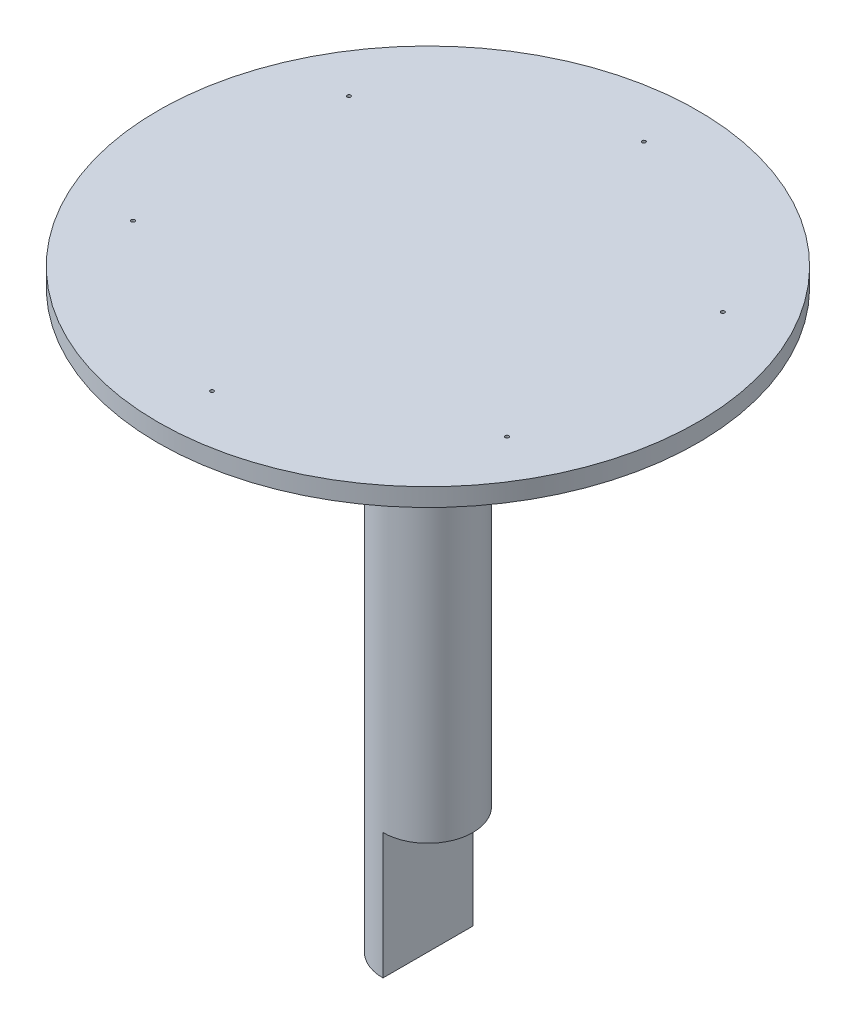
ISO-10303-21;
HEADER;
FILE_DESCRIPTION(('STEP AP214'),'2;1');
FILE_NAME('part.step','',(''),(''),'','','');
FILE_SCHEMA(('AUTOMOTIVE_DESIGN { 1 0 10303 214 1 1 1 1 }'));
ENDSEC;
DATA;
#1=APPLICATION_CONTEXT('core data for automotive mechanical design processes');
#2=APPLICATION_PROTOCOL_DEFINITION('international standard','automotive_design',2000,#1);
#3=PRODUCT_CONTEXT('',#1,'mechanical');
#4=PRODUCT('Part','Part','',(#3));
#5=PRODUCT_RELATED_PRODUCT_CATEGORY('part','',(#4));
#6=PRODUCT_DEFINITION_FORMATION('','',#4);
#7=PRODUCT_DEFINITION_CONTEXT('part definition',#1,'design');
#8=PRODUCT_DEFINITION('design','',#6,#7);
#9=PRODUCT_DEFINITION_SHAPE('','',#8);
#10=(LENGTH_UNIT() NAMED_UNIT(*) SI_UNIT(.MILLI.,.METRE.));
#11=(NAMED_UNIT(*) PLANE_ANGLE_UNIT() SI_UNIT($,.RADIAN.));
#12=(NAMED_UNIT(*) SI_UNIT($,.STERADIAN.) SOLID_ANGLE_UNIT());
#13=UNCERTAINTY_MEASURE_WITH_UNIT(LENGTH_MEASURE(1.E-05),#10,'distance_accuracy_value','');
#14=(GEOMETRIC_REPRESENTATION_CONTEXT(3) GLOBAL_UNCERTAINTY_ASSIGNED_CONTEXT((#13)) GLOBAL_UNIT_ASSIGNED_CONTEXT((#10,
#11,#12)) REPRESENTATION_CONTEXT('',''));
#15=CARTESIAN_POINT('',(0.,0.,0.));
#16=DIRECTION('',(0.,0.,1.));
#17=DIRECTION('',(1.,0.,0.));
#18=AXIS2_PLACEMENT_3D('',#15,#16,#17);
#19=CARTESIAN_POINT('',(31.049273333984,320.,8.00239003453196));
#20=DIRECTION('',(0.,-1.,0.));
#21=DIRECTION('',(0.,0.,-1.));
#22=AXIS2_PLACEMENT_3D('',#19,#20,#21);
#23=CYLINDRICAL_SURFACE('',#22,25.);
#24=CARTESIAN_POINT('',(31.049273333984,320.,8.00239003453196));
#25=DIRECTION('',(0.,1.,0.));
#26=DIRECTION('',(0.,0.,1.));
#27=AXIS2_PLACEMENT_3D('',#24,#25,#26);
#28=CIRCLE('',#27,25.);
#29=CARTESIAN_POINT('',(31.049273333984,320.,33.002390034532));
#30=VERTEX_POINT('',#29);
#31=EDGE_CURVE('E11',#30,#30,#28,.T.);
#32=ORIENTED_EDGE('',*,*,#31,.F.);
#33=EDGE_LOOP('',(#32));
#34=FACE_BOUND('',#33,.T.);
#35=CARTESIAN_POINT('',(31.049273333984,70.,8.00239003453196));
#36=DIRECTION('',(0.,-1.,0.));
#37=DIRECTION('',(0.,0.,-1.));
#38=AXIS2_PLACEMENT_3D('',#35,#36,#37);
#39=CIRCLE('',#38,25.);
#40=CARTESIAN_POINT('',(31.049273333984,70.,-16.9976099654681));
#41=VERTEX_POINT('',#40);
#42=CARTESIAN_POINT('',(31.049273333984,70.,33.002390034532));
#43=VERTEX_POINT('',#42);
#44=EDGE_CURVE('E64',#41,#43,#39,.T.);
#45=ORIENTED_EDGE('',*,*,#44,.F.);
#46=DIRECTION('',(0.,-1.,0.));
#47=VECTOR('',#46,1.);
#48=CARTESIAN_POINT('',(31.049273333984,70.,-16.9976099654681));
#49=LINE('',#48,#47);
#50=CARTESIAN_POINT('',(31.049273333984,0.,-16.9976099654681));
#51=VERTEX_POINT('',#50);
#52=EDGE_CURVE('E54',#41,#51,#49,.T.);
#53=ORIENTED_EDGE('',*,*,#52,.T.);
#54=CARTESIAN_POINT('',(31.049273333984,0.,8.00239003453196));
#55=DIRECTION('',(0.,1.,0.));
#56=DIRECTION('',(0.,0.,1.));
#57=AXIS2_PLACEMENT_3D('',#54,#55,#56);
#58=CIRCLE('',#57,25.);
#59=CARTESIAN_POINT('',(31.049273333984,0.,33.002390034532));
#60=VERTEX_POINT('',#59);
#61=EDGE_CURVE('E37',#51,#60,#58,.T.);
#62=ORIENTED_EDGE('',*,*,#61,.T.);
#63=DIRECTION('',(0.,-1.,0.));
#64=VECTOR('',#63,1.);
#65=CARTESIAN_POINT('',(31.049273333984,70.,33.002390034532));
#66=LINE('',#65,#64);
#67=EDGE_CURVE('E48',#43,#60,#66,.T.);
#68=ORIENTED_EDGE('',*,*,#67,.F.);
#69=EDGE_LOOP('',(#45,#53,#62,#68));
#70=FACE_BOUND('',#69,.T.);
#71=ADVANCED_FACE('F34',(#34,#70),#23,.T.);
#72=CARTESIAN_POINT('',(0.,0.,0.));
#73=DIRECTION('',(0.,1.,0.));
#74=DIRECTION('',(0.,0.,1.));
#75=AXIS2_PLACEMENT_3D('',#72,#73,#74);
#76=PLANE('',#75);
#77=ORIENTED_EDGE('',*,*,#61,.F.);
#78=DIRECTION('',(0.,0.,-1.));
#79=VECTOR('',#78,1.);
#80=CARTESIAN_POINT('',(31.049273333984,0.,0.));
#81=LINE('',#80,#79);
#82=EDGE_CURVE('E59',#60,#51,#81,.T.);
#83=ORIENTED_EDGE('',*,*,#82,.F.);
#84=EDGE_LOOP('',(#77,#83));
#85=FACE_BOUND('',#84,.T.);
#86=ADVANCED_FACE('F70',(#85),#76,.F.);
#87=CARTESIAN_POINT('',(31.049273333984,70.,0.));
#88=DIRECTION('',(-1.,0.,0.));
#89=DIRECTION('',(0.,0.,1.));
#90=AXIS2_PLACEMENT_3D('',#87,#88,#89);
#91=PLANE('',#90);
#92=ORIENTED_EDGE('',*,*,#82,.T.);
#93=ORIENTED_EDGE('',*,*,#52,.F.);
#94=DIRECTION('',(0.,0.,-1.));
#95=VECTOR('',#94,1.);
#96=CARTESIAN_POINT('',(31.049273333984,70.,0.));
#97=LINE('',#96,#95);
#98=EDGE_CURVE('E166',#43,#41,#97,.T.);
#99=ORIENTED_EDGE('',*,*,#98,.F.);
#100=ORIENTED_EDGE('',*,*,#67,.T.);
#101=EDGE_LOOP('',(#92,#93,#99,#100));
#102=FACE_BOUND('',#101,.T.);
#103=ADVANCED_FACE('F60',(#102),#91,.F.);
#104=CARTESIAN_POINT('',(0.,70.,0.));
#105=DIRECTION('',(0.,-1.,0.));
#106=DIRECTION('',(0.,0.,-1.));
#107=AXIS2_PLACEMENT_3D('',#104,#105,#106);
#108=PLANE('',#107);
#109=ORIENTED_EDGE('',*,*,#44,.T.);
#110=ORIENTED_EDGE('',*,*,#98,.T.);
#111=EDGE_LOOP('',(#109,#110));
#112=FACE_BOUND('',#111,.T.);
#113=ADVANCED_FACE('F76',(#112),#108,.T.);
#114=CARTESIAN_POINT('',(31.049273333984,320.,8.00239003453196));
#115=DIRECTION('',(0.,1.,0.));
#116=DIRECTION('',(0.,0.,1.));
#117=AXIS2_PLACEMENT_3D('',#114,#115,#116);
#118=PLANE('',#117);
#119=CARTESIAN_POINT('',(134.972321788117,320.,68.0023900345306));
#120=DIRECTION('',(0.,1.,0.));
#121=DIRECTION('',(0.,0.,1.));
#122=AXIS2_PLACEMENT_3D('',#119,#120,#121);
#123=CIRCLE('',#122,0.999999999999998);
#124=CARTESIAN_POINT('',(134.972321788117,320.,69.0023900345306));
#125=VERTEX_POINT('',#124);
#126=EDGE_CURVE('E123',#125,#125,#123,.T.);
#127=ORIENTED_EDGE('',*,*,#126,.T.);
#128=EDGE_LOOP('',(#127));
#129=FACE_BOUND('',#128,.T.);
#130=CARTESIAN_POINT('',(134.972321788117,320.,-51.9976099654682));
#131=DIRECTION('',(0.,1.,0.));
#132=DIRECTION('',(0.,0.,1.));
#133=AXIS2_PLACEMENT_3D('',#130,#131,#132);
#134=CIRCLE('',#133,0.999999999999968);
#135=CARTESIAN_POINT('',(134.972321788117,320.,-50.9976099654682));
#136=VERTEX_POINT('',#135);
#137=EDGE_CURVE('E131',#136,#136,#134,.T.);
#138=ORIENTED_EDGE('',*,*,#137,.T.);
#139=EDGE_LOOP('',(#138));
#140=FACE_BOUND('',#139,.T.);
#141=CARTESIAN_POINT('',(31.0492733339836,320.,-111.997609965468));
#142=DIRECTION('',(0.,1.,0.));
#143=DIRECTION('',(0.,0.,1.));
#144=AXIS2_PLACEMENT_3D('',#141,#142,#143);
#145=CIRCLE('',#144,1.00000000000001);
#146=CARTESIAN_POINT('',(31.0492733339836,320.,-110.997609965468));
#147=VERTEX_POINT('',#146);
#148=EDGE_CURVE('E137',#147,#147,#145,.T.);
#149=ORIENTED_EDGE('',*,*,#148,.T.);
#150=EDGE_LOOP('',(#149));
#151=FACE_BOUND('',#150,.T.);
#152=CARTESIAN_POINT('',(-72.873775120149,320.,-51.9976099654674));
#153=DIRECTION('',(0.,1.,0.));
#154=DIRECTION('',(0.,0.,1.));
#155=AXIS2_PLACEMENT_3D('',#152,#153,#154);
#156=CIRCLE('',#155,0.999999999999998);
#157=CARTESIAN_POINT('',(-72.873775120149,320.,-50.9976099654674));
#158=VERTEX_POINT('',#157);
#159=EDGE_CURVE('E143',#158,#158,#156,.T.);
#160=ORIENTED_EDGE('',*,*,#159,.T.);
#161=EDGE_LOOP('',(#160));
#162=FACE_BOUND('',#161,.T.);
#163=CARTESIAN_POINT('',(-72.8737751201481,320.,68.0023900345328));
#164=DIRECTION('',(0.,1.,0.));
#165=DIRECTION('',(0.,0.,1.));
#166=AXIS2_PLACEMENT_3D('',#163,#164,#165);
#167=CIRCLE('',#166,0.999999999999981);
#168=CARTESIAN_POINT('',(-72.8737751201481,320.,69.0023900345328));
#169=VERTEX_POINT('',#168);
#170=EDGE_CURVE('E149',#169,#169,#167,.T.);
#171=ORIENTED_EDGE('',*,*,#170,.T.);
#172=EDGE_LOOP('',(#171));
#173=FACE_BOUND('',#172,.T.);
#174=CARTESIAN_POINT('',(31.0492733339852,320.,128.002390034532));
#175=DIRECTION('',(0.,1.,0.));
#176=DIRECTION('',(0.,0.,1.));
#177=AXIS2_PLACEMENT_3D('',#174,#175,#176);
#178=CIRCLE('',#177,0.999999999999998);
#179=CARTESIAN_POINT('',(31.0492733339852,320.,129.002390034532));
#180=VERTEX_POINT('',#179);
#181=EDGE_CURVE('E155',#180,#180,#178,.T.);
#182=ORIENTED_EDGE('',*,*,#181,.T.);
#183=EDGE_LOOP('',(#182));
#184=FACE_BOUND('',#183,.T.);
#185=CARTESIAN_POINT('',(31.049273333984,320.,8.00239003453196));
#186=DIRECTION('',(0.,1.,0.));
#187=DIRECTION('',(0.,0.,1.));
#188=AXIS2_PLACEMENT_3D('',#185,#186,#187);
#189=CIRCLE('',#188,150.);
#190=CARTESIAN_POINT('',(31.049273333984,320.,158.002390034532));
#191=VERTEX_POINT('',#190);
#192=EDGE_CURVE('E158',#191,#191,#189,.T.);
#193=ORIENTED_EDGE('',*,*,#192,.F.);
#194=EDGE_LOOP('',(#193));
#195=FACE_BOUND('',#194,.T.);
#196=ORIENTED_EDGE('',*,*,#31,.T.);
#197=EDGE_LOOP('',(#196));
#198=FACE_BOUND('',#197,.T.);
#199=ADVANCED_FACE('F82',(#129,#140,#151,#162,#173,#184,#195,#198),#118,.F.);
#200=CARTESIAN_POINT('',(31.049273333984,330.,8.00239003453196));
#201=DIRECTION('',(0.,-1.,0.));
#202=DIRECTION('',(0.,0.,-1.));
#203=AXIS2_PLACEMENT_3D('',#200,#201,#202);
#204=CYLINDRICAL_SURFACE('',#203,150.);
#205=CARTESIAN_POINT('',(31.049273333984,330.,8.00239003453196));
#206=DIRECTION('',(0.,1.,0.));
#207=DIRECTION('',(0.,0.,1.));
#208=AXIS2_PLACEMENT_3D('',#205,#206,#207);
#209=CIRCLE('',#208,150.);
#210=CARTESIAN_POINT('',(31.049273333984,330.,158.002390034532));
#211=VERTEX_POINT('',#210);
#212=EDGE_CURVE('E65',#211,#211,#209,.T.);
#213=ORIENTED_EDGE('',*,*,#212,.F.);
#214=EDGE_LOOP('',(#213));
#215=FACE_BOUND('',#214,.T.);
#216=ORIENTED_EDGE('',*,*,#192,.T.);
#217=EDGE_LOOP('',(#216));
#218=FACE_BOUND('',#217,.T.);
#219=ADVANCED_FACE('F84',(#215,#218),#204,.T.);
#220=CARTESIAN_POINT('',(31.049273333984,330.,8.00239003453196));
#221=DIRECTION('',(0.,1.,0.));
#222=DIRECTION('',(0.,0.,1.));
#223=AXIS2_PLACEMENT_3D('',#220,#221,#222);
#224=PLANE('',#223);
#225=CARTESIAN_POINT('',(134.972321788117,330.,68.0023900345306));
#226=DIRECTION('',(0.,1.,0.));
#227=DIRECTION('',(0.,0.,1.));
#228=AXIS2_PLACEMENT_3D('',#225,#226,#227);
#229=CIRCLE('',#228,0.999999999999998);
#230=CARTESIAN_POINT('',(134.972321788117,330.,69.0023900345306));
#231=VERTEX_POINT('',#230);
#232=EDGE_CURVE('E126',#231,#231,#229,.T.);
#233=ORIENTED_EDGE('',*,*,#232,.F.);
#234=EDGE_LOOP('',(#233));
#235=FACE_BOUND('',#234,.T.);
#236=CARTESIAN_POINT('',(134.972321788117,330.,-51.9976099654682));
#237=DIRECTION('',(0.,1.,0.));
#238=DIRECTION('',(0.,0.,1.));
#239=AXIS2_PLACEMENT_3D('',#236,#237,#238);
#240=CIRCLE('',#239,0.999999999999968);
#241=CARTESIAN_POINT('',(134.972321788117,330.,-50.9976099654682));
#242=VERTEX_POINT('',#241);
#243=EDGE_CURVE('E128',#242,#242,#240,.T.);
#244=ORIENTED_EDGE('',*,*,#243,.F.);
#245=EDGE_LOOP('',(#244));
#246=FACE_BOUND('',#245,.T.);
#247=CARTESIAN_POINT('',(31.0492733339836,330.,-111.997609965468));
#248=DIRECTION('',(0.,1.,0.));
#249=DIRECTION('',(0.,0.,1.));
#250=AXIS2_PLACEMENT_3D('',#247,#248,#249);
#251=CIRCLE('',#250,1.00000000000001);
#252=CARTESIAN_POINT('',(31.0492733339836,330.,-110.997609965468));
#253=VERTEX_POINT('',#252);
#254=EDGE_CURVE('E134',#253,#253,#251,.T.);
#255=ORIENTED_EDGE('',*,*,#254,.F.);
#256=EDGE_LOOP('',(#255));
#257=FACE_BOUND('',#256,.T.);
#258=CARTESIAN_POINT('',(-72.873775120149,330.,-51.9976099654674));
#259=DIRECTION('',(0.,1.,0.));
#260=DIRECTION('',(0.,0.,1.));
#261=AXIS2_PLACEMENT_3D('',#258,#259,#260);
#262=CIRCLE('',#261,0.999999999999998);
#263=CARTESIAN_POINT('',(-72.873775120149,330.,-50.9976099654674));
#264=VERTEX_POINT('',#263);
#265=EDGE_CURVE('E140',#264,#264,#262,.T.);
#266=ORIENTED_EDGE('',*,*,#265,.F.);
#267=EDGE_LOOP('',(#266));
#268=FACE_BOUND('',#267,.T.);
#269=CARTESIAN_POINT('',(-72.8737751201481,330.,68.0023900345328));
#270=DIRECTION('',(0.,1.,0.));
#271=DIRECTION('',(0.,0.,1.));
#272=AXIS2_PLACEMENT_3D('',#269,#270,#271);
#273=CIRCLE('',#272,0.999999999999981);
#274=CARTESIAN_POINT('',(-72.8737751201481,330.,69.0023900345328));
#275=VERTEX_POINT('',#274);
#276=EDGE_CURVE('E146',#275,#275,#273,.T.);
#277=ORIENTED_EDGE('',*,*,#276,.F.);
#278=EDGE_LOOP('',(#277));
#279=FACE_BOUND('',#278,.T.);
#280=CARTESIAN_POINT('',(31.0492733339852,330.,128.002390034532));
#281=DIRECTION('',(0.,1.,0.));
#282=DIRECTION('',(0.,0.,1.));
#283=AXIS2_PLACEMENT_3D('',#280,#281,#282);
#284=CIRCLE('',#283,0.999999999999998);
#285=CARTESIAN_POINT('',(31.0492733339852,330.,129.002390034532));
#286=VERTEX_POINT('',#285);
#287=EDGE_CURVE('E152',#286,#286,#284,.T.);
#288=ORIENTED_EDGE('',*,*,#287,.F.);
#289=EDGE_LOOP('',(#288));
#290=FACE_BOUND('',#289,.T.);
#291=ORIENTED_EDGE('',*,*,#212,.T.);
#292=EDGE_LOOP('',(#291));
#293=FACE_BOUND('',#292,.T.);
#294=ADVANCED_FACE('F87',(#235,#246,#257,#268,#279,#290,#293),#224,.T.);
#295=CARTESIAN_POINT('',(31.0492733339852,320.,128.002390034532));
#296=DIRECTION('',(0.,1.,0.));
#297=DIRECTION('',(0.,0.,1.));
#298=AXIS2_PLACEMENT_3D('',#295,#296,#297);
#299=CYLINDRICAL_SURFACE('',#298,0.999999999999998);
#300=ORIENTED_EDGE('',*,*,#181,.F.);
#301=EDGE_LOOP('',(#300));
#302=FACE_BOUND('',#301,.T.);
#303=ORIENTED_EDGE('',*,*,#287,.T.);
#304=EDGE_LOOP('',(#303));
#305=FACE_BOUND('',#304,.T.);
#306=ADVANCED_FACE('F94',(#302,#305),#299,.F.);
#307=CARTESIAN_POINT('',(-72.8737751201481,320.,68.0023900345328));
#308=DIRECTION('',(0.,1.,0.));
#309=DIRECTION('',(0.,0.,1.));
#310=AXIS2_PLACEMENT_3D('',#307,#308,#309);
#311=CYLINDRICAL_SURFACE('',#310,0.999999999999981);
#312=ORIENTED_EDGE('',*,*,#170,.F.);
#313=EDGE_LOOP('',(#312));
#314=FACE_BOUND('',#313,.T.);
#315=ORIENTED_EDGE('',*,*,#276,.T.);
#316=EDGE_LOOP('',(#315));
#317=FACE_BOUND('',#316,.T.);
#318=ADVANCED_FACE('F98',(#314,#317),#311,.F.);
#319=CARTESIAN_POINT('',(-72.873775120149,320.,-51.9976099654674));
#320=DIRECTION('',(0.,1.,0.));
#321=DIRECTION('',(0.,0.,1.));
#322=AXIS2_PLACEMENT_3D('',#319,#320,#321);
#323=CYLINDRICAL_SURFACE('',#322,0.999999999999998);
#324=ORIENTED_EDGE('',*,*,#159,.F.);
#325=EDGE_LOOP('',(#324));
#326=FACE_BOUND('',#325,.T.);
#327=ORIENTED_EDGE('',*,*,#265,.T.);
#328=EDGE_LOOP('',(#327));
#329=FACE_BOUND('',#328,.T.);
#330=ADVANCED_FACE('F102',(#326,#329),#323,.F.);
#331=CARTESIAN_POINT('',(31.0492733339836,320.,-111.997609965468));
#332=DIRECTION('',(0.,1.,0.));
#333=DIRECTION('',(0.,0.,1.));
#334=AXIS2_PLACEMENT_3D('',#331,#332,#333);
#335=CYLINDRICAL_SURFACE('',#334,1.00000000000001);
#336=ORIENTED_EDGE('',*,*,#148,.F.);
#337=EDGE_LOOP('',(#336));
#338=FACE_BOUND('',#337,.T.);
#339=ORIENTED_EDGE('',*,*,#254,.T.);
#340=EDGE_LOOP('',(#339));
#341=FACE_BOUND('',#340,.T.);
#342=ADVANCED_FACE('F106',(#338,#341),#335,.F.);
#343=CARTESIAN_POINT('',(134.972321788117,320.,-51.9976099654682));
#344=DIRECTION('',(0.,1.,0.));
#345=DIRECTION('',(0.,0.,1.));
#346=AXIS2_PLACEMENT_3D('',#343,#344,#345);
#347=CYLINDRICAL_SURFACE('',#346,0.999999999999968);
#348=ORIENTED_EDGE('',*,*,#137,.F.);
#349=EDGE_LOOP('',(#348));
#350=FACE_BOUND('',#349,.T.);
#351=ORIENTED_EDGE('',*,*,#243,.T.);
#352=EDGE_LOOP('',(#351));
#353=FACE_BOUND('',#352,.T.);
#354=ADVANCED_FACE('F110',(#350,#353),#347,.F.);
#355=CARTESIAN_POINT('',(134.972321788117,320.,68.0023900345306));
#356=DIRECTION('',(0.,1.,0.));
#357=DIRECTION('',(0.,0.,1.));
#358=AXIS2_PLACEMENT_3D('',#355,#356,#357);
#359=CYLINDRICAL_SURFACE('',#358,0.999999999999998);
#360=ORIENTED_EDGE('',*,*,#126,.F.);
#361=EDGE_LOOP('',(#360));
#362=FACE_BOUND('',#361,.T.);
#363=ORIENTED_EDGE('',*,*,#232,.T.);
#364=EDGE_LOOP('',(#363));
#365=FACE_BOUND('',#364,.T.);
#366=ADVANCED_FACE('F114',(#362,#365),#359,.F.);
#367=CLOSED_SHELL('',(#71,#86,#103,#113,#199,#219,#294,#306,#318,#330,#342,#354,#366));
#368=MANIFOLD_SOLID_BREP('B2',#367);
#369=ADVANCED_BREP_SHAPE_REPRESENTATION('',(#18,#368),#14);
#370=SHAPE_DEFINITION_REPRESENTATION(#9,#369);
ENDSEC;
END-ISO-10303-21;
